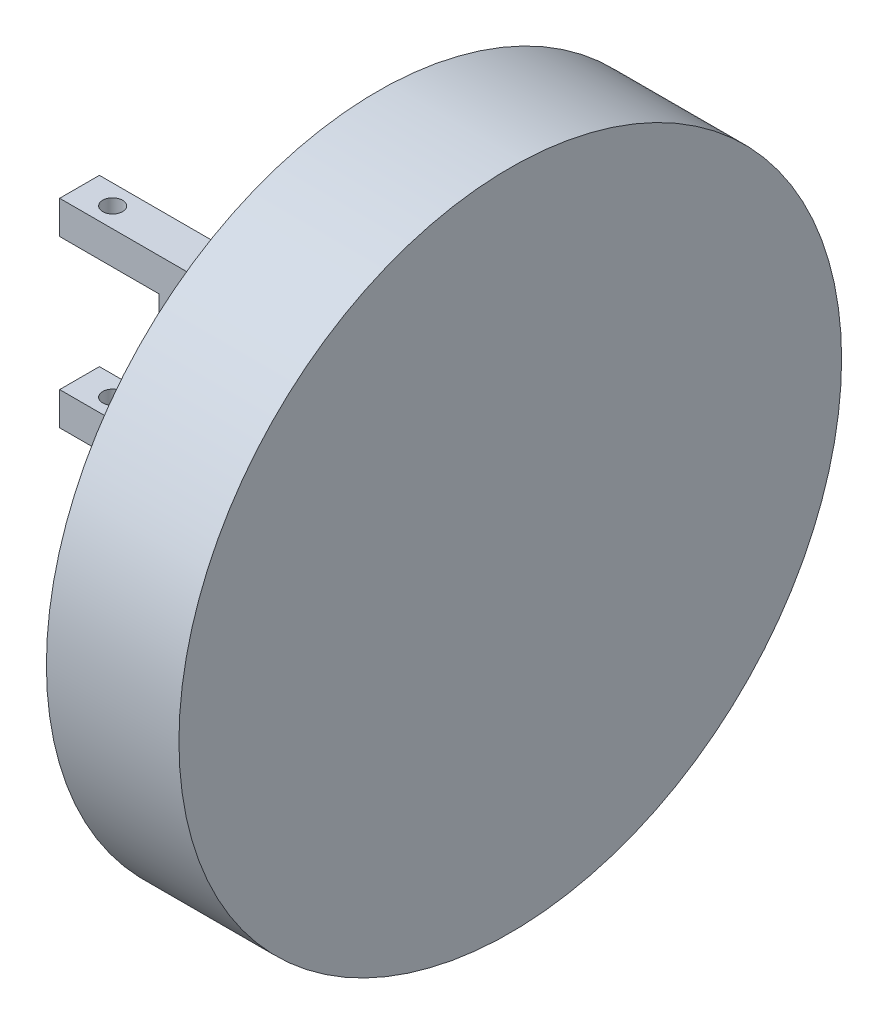
ISO-10303-21;
HEADER;
FILE_DESCRIPTION(('STEP AP214'),'2;1');
FILE_NAME('part.step','',(''),(''),'','','');
FILE_SCHEMA(('AUTOMOTIVE_DESIGN { 1 0 10303 214 1 1 1 1 }'));
ENDSEC;
DATA;
#1=APPLICATION_CONTEXT('core data for automotive mechanical design processes');
#2=APPLICATION_PROTOCOL_DEFINITION('international standard','automotive_design',2000,#1);
#3=PRODUCT_CONTEXT('',#1,'mechanical');
#4=PRODUCT('Part','Part','',(#3));
#5=PRODUCT_RELATED_PRODUCT_CATEGORY('part','',(#4));
#6=PRODUCT_DEFINITION_FORMATION('','',#4);
#7=PRODUCT_DEFINITION_CONTEXT('part definition',#1,'design');
#8=PRODUCT_DEFINITION('design','',#6,#7);
#9=PRODUCT_DEFINITION_SHAPE('','',#8);
#10=(LENGTH_UNIT() NAMED_UNIT(*) SI_UNIT(.MILLI.,.METRE.));
#11=(NAMED_UNIT(*) PLANE_ANGLE_UNIT() SI_UNIT($,.RADIAN.));
#12=(NAMED_UNIT(*) SI_UNIT($,.STERADIAN.) SOLID_ANGLE_UNIT());
#13=UNCERTAINTY_MEASURE_WITH_UNIT(LENGTH_MEASURE(1.E-05),#10,'distance_accuracy_value','');
#14=(GEOMETRIC_REPRESENTATION_CONTEXT(3) GLOBAL_UNCERTAINTY_ASSIGNED_CONTEXT((#13)) GLOBAL_UNIT_ASSIGNED_CONTEXT((#10,
#11,#12)) REPRESENTATION_CONTEXT('',''));
#15=CARTESIAN_POINT('',(0.,0.,0.));
#16=DIRECTION('',(0.,0.,1.));
#17=DIRECTION('',(1.,0.,0.));
#18=AXIS2_PLACEMENT_3D('',#15,#16,#17);
#19=CARTESIAN_POINT('',(84.9999999999999,0.,125.));
#20=DIRECTION('',(1.,0.,0.));
#21=DIRECTION('',(0.,0.,-1.));
#22=AXIS2_PLACEMENT_3D('',#19,#20,#21);
#23=CYLINDRICAL_SURFACE('',#22,1.5);
#24=CARTESIAN_POINT('',(99.9999999999999,0.,125.));
#25=DIRECTION('',(1.,0.,0.));
#26=DIRECTION('',(0.,0.,-1.));
#27=AXIS2_PLACEMENT_3D('',#24,#25,#26);
#28=CIRCLE('',#27,1.5);
#29=CARTESIAN_POINT('',(99.9999999999999,0.,123.5));
#30=VERTEX_POINT('',#29);
#31=EDGE_CURVE('E178',#30,#30,#28,.T.);
#32=ORIENTED_EDGE('',*,*,#31,.F.);
#33=EDGE_LOOP('',(#32));
#34=FACE_BOUND('',#33,.T.);
#35=CARTESIAN_POINT('',(87.4999999999999,0.,125.));
#36=DIRECTION('',(-1.,0.,0.));
#37=DIRECTION('',(0.,0.,1.));
#38=AXIS2_PLACEMENT_3D('',#35,#36,#37);
#39=CIRCLE('',#38,1.5);
#40=CARTESIAN_POINT('',(87.4999999999999,0.,123.5));
#41=VERTEX_POINT('',#40);
#42=CARTESIAN_POINT('',(87.4999999999999,0.,126.5));
#43=VERTEX_POINT('',#42);
#44=EDGE_CURVE('E52',#41,#43,#39,.F.);
#45=ORIENTED_EDGE('',*,*,#44,.T.);
#46=EDGE_CURVE('E11',#43,#41,#39,.F.);
#47=ORIENTED_EDGE('',*,*,#46,.T.);
#48=EDGE_LOOP('',(#45,#47));
#49=FACE_BOUND('',#48,.T.);
#50=ADVANCED_FACE('F43',(#34,#49),#23,.T.);
#51=CARTESIAN_POINT('',(110.,0.,125.));
#52=DIRECTION('',(-1.,0.,0.));
#53=DIRECTION('',(0.,0.,1.));
#54=AXIS2_PLACEMENT_3D('',#51,#52,#53);
#55=CYLINDRICAL_SURFACE('',#54,25.);
#56=CARTESIAN_POINT('',(110.,0.,125.));
#57=DIRECTION('',(1.,0.,0.));
#58=DIRECTION('',(0.,0.,-1.));
#59=AXIS2_PLACEMENT_3D('',#56,#57,#58);
#60=CIRCLE('',#59,25.);
#61=CARTESIAN_POINT('',(110.,0.,100.));
#62=VERTEX_POINT('',#61);
#63=EDGE_CURVE('E194',#62,#62,#60,.T.);
#64=ORIENTED_EDGE('',*,*,#63,.F.);
#65=EDGE_LOOP('',(#64));
#66=FACE_BOUND('',#65,.T.);
#67=CARTESIAN_POINT('',(99.9999999999999,0.,125.));
#68=DIRECTION('',(1.,0.,0.));
#69=DIRECTION('',(0.,0.,-1.));
#70=AXIS2_PLACEMENT_3D('',#67,#68,#69);
#71=CIRCLE('',#70,25.);
#72=CARTESIAN_POINT('',(99.9999999999999,0.,100.));
#73=VERTEX_POINT('',#72);
#74=EDGE_CURVE('E193',#73,#73,#71,.T.);
#75=ORIENTED_EDGE('',*,*,#74,.T.);
#76=EDGE_LOOP('',(#75));
#77=FACE_BOUND('',#76,.T.);
#78=ADVANCED_FACE('F45',(#66,#77),#55,.T.);
#79=CARTESIAN_POINT('',(110.,0.,0.));
#80=DIRECTION('',(1.,0.,0.));
#81=DIRECTION('',(0.,0.,-1.));
#82=AXIS2_PLACEMENT_3D('',#79,#80,#81);
#83=PLANE('',#82);
#84=ORIENTED_EDGE('',*,*,#63,.T.);
#85=EDGE_LOOP('',(#84));
#86=FACE_BOUND('',#85,.T.);
#87=ADVANCED_FACE('F206',(#86),#83,.T.);
#88=CARTESIAN_POINT('',(99.9999999999999,0.,0.));
#89=DIRECTION('',(1.,0.,0.));
#90=DIRECTION('',(0.,0.,-1.));
#91=AXIS2_PLACEMENT_3D('',#88,#89,#90);
#92=PLANE('',#91);
#93=ORIENTED_EDGE('',*,*,#31,.T.);
#94=EDGE_LOOP('',(#93));
#95=FACE_BOUND('',#94,.T.);
#96=ORIENTED_EDGE('',*,*,#74,.F.);
#97=EDGE_LOOP('',(#96));
#98=FACE_BOUND('',#97,.T.);
#99=ADVANCED_FACE('F214',(#95,#98),#92,.F.);
#100=CARTESIAN_POINT('',(87.4999999999999,0.,123.5));
#101=DIRECTION('',(-1.,0.,0.));
#102=DIRECTION('',(0.,0.,1.));
#103=AXIS2_PLACEMENT_3D('',#100,#101,#102);
#104=PLANE('',#103);
#105=ORIENTED_EDGE('',*,*,#46,.F.);
#106=DIRECTION('',(0.,-1.,0.));
#107=VECTOR('',#106,1.);
#108=CARTESIAN_POINT('',(87.4999999999999,0.,126.5));
#109=LINE('',#108,#107);
#110=CARTESIAN_POINT('',(87.4999999999999,-7.5,126.5));
#111=VERTEX_POINT('',#110);
#112=EDGE_CURVE('E114',#43,#111,#109,.T.);
#113=ORIENTED_EDGE('',*,*,#112,.T.);
#114=DIRECTION('',(0.,0.,1.));
#115=VECTOR('',#114,1.);
#116=CARTESIAN_POINT('',(87.4999999999999,-7.5,123.5));
#117=LINE('',#116,#115);
#118=CARTESIAN_POINT('',(87.4999999999999,-7.5,123.5));
#119=VERTEX_POINT('',#118);
#120=EDGE_CURVE('E117',#119,#111,#117,.T.);
#121=ORIENTED_EDGE('',*,*,#120,.F.);
#122=DIRECTION('',(0.,-1.,0.));
#123=VECTOR('',#122,1.);
#124=CARTESIAN_POINT('',(87.4999999999999,0.,123.5));
#125=LINE('',#124,#123);
#126=EDGE_CURVE('E159',#41,#119,#125,.T.);
#127=ORIENTED_EDGE('',*,*,#126,.F.);
#128=EDGE_LOOP('',(#105,#113,#121,#127));
#129=FACE_BOUND('',#128,.T.);
#130=ADVANCED_FACE('F116',(#129),#104,.F.);
#131=CARTESIAN_POINT('',(0.,0.,123.5));
#132=DIRECTION('',(0.,0.,1.));
#133=DIRECTION('',(1.,0.,0.));
#134=AXIS2_PLACEMENT_3D('',#131,#132,#133);
#135=PLANE('',#134);
#136=CARTESIAN_POINT('',(87.4999999999999,7.5,123.5));
#137=VERTEX_POINT('',#136);
#138=EDGE_CURVE('E160',#137,#41,#125,.T.);
#139=ORIENTED_EDGE('',*,*,#138,.T.);
#140=ORIENTED_EDGE('',*,*,#126,.T.);
#141=DIRECTION('',(-1.,0.,0.));
#142=VECTOR('',#141,1.);
#143=CARTESIAN_POINT('',(0.,-7.49999999999999,123.5));
#144=LINE('',#143,#142);
#145=CARTESIAN_POINT('',(77.4999999999999,-7.5,123.5));
#146=VERTEX_POINT('',#145);
#147=EDGE_CURVE('E129',#119,#146,#144,.T.);
#148=ORIENTED_EDGE('',*,*,#147,.T.);
#149=DIRECTION('',(0.,1.,0.));
#150=VECTOR('',#149,1.);
#151=CARTESIAN_POINT('',(77.4999999999999,0.,123.5));
#152=LINE('',#151,#150);
#153=CARTESIAN_POINT('',(77.4999999999999,-5.,123.5));
#154=VERTEX_POINT('',#153);
#155=EDGE_CURVE('E131',#146,#154,#152,.T.);
#156=ORIENTED_EDGE('',*,*,#155,.T.);
#157=DIRECTION('',(-1.,0.,0.));
#158=VECTOR('',#157,1.);
#159=CARTESIAN_POINT('',(0.,-5.00000000000001,123.5));
#160=LINE('',#159,#158);
#161=CARTESIAN_POINT('',(84.9999999999999,-5.,123.5));
#162=VERTEX_POINT('',#161);
#163=EDGE_CURVE('E172',#162,#154,#160,.T.);
#164=ORIENTED_EDGE('',*,*,#163,.F.);
#165=DIRECTION('',(0.,-1.,0.));
#166=VECTOR('',#165,1.);
#167=CARTESIAN_POINT('',(84.9999999999999,0.,123.5));
#168=LINE('',#167,#166);
#169=CARTESIAN_POINT('',(84.9999999999999,5.,123.5));
#170=VERTEX_POINT('',#169);
#171=EDGE_CURVE('E170',#170,#162,#168,.T.);
#172=ORIENTED_EDGE('',*,*,#171,.F.);
#173=DIRECTION('',(-1.,0.,0.));
#174=VECTOR('',#173,1.);
#175=CARTESIAN_POINT('',(0.,4.99999999999999,123.5));
#176=LINE('',#175,#174);
#177=CARTESIAN_POINT('',(77.4999999999999,5.,123.5));
#178=VERTEX_POINT('',#177);
#179=EDGE_CURVE('E168',#170,#178,#176,.T.);
#180=ORIENTED_EDGE('',*,*,#179,.T.);
#181=DIRECTION('',(0.,-1.,0.));
#182=VECTOR('',#181,1.);
#183=CARTESIAN_POINT('',(77.4999999999999,0.,123.5));
#184=LINE('',#183,#182);
#185=CARTESIAN_POINT('',(77.4999999999999,7.5,123.5));
#186=VERTEX_POINT('',#185);
#187=EDGE_CURVE('E165',#186,#178,#184,.T.);
#188=ORIENTED_EDGE('',*,*,#187,.F.);
#189=DIRECTION('',(1.,0.,0.));
#190=VECTOR('',#189,1.);
#191=CARTESIAN_POINT('',(0.,7.5,123.5));
#192=LINE('',#191,#190);
#193=EDGE_CURVE('E163',#186,#137,#192,.T.);
#194=ORIENTED_EDGE('',*,*,#193,.T.);
#195=EDGE_LOOP('',(#139,#140,#148,#156,#164,#172,#180,#188,#194));
#196=FACE_BOUND('',#195,.T.);
#197=ADVANCED_FACE('F223',(#196),#135,.F.);
#198=CARTESIAN_POINT('',(0.,0.,126.5));
#199=DIRECTION('',(0.,0.,1.));
#200=DIRECTION('',(1.,0.,0.));
#201=AXIS2_PLACEMENT_3D('',#198,#199,#200);
#202=PLANE('',#201);
#203=DIRECTION('',(0.,-1.,0.));
#204=VECTOR('',#203,1.);
#205=CARTESIAN_POINT('',(84.9999999999999,0.,126.5));
#206=LINE('',#205,#204);
#207=CARTESIAN_POINT('',(84.9999999999999,5.,126.5));
#208=VERTEX_POINT('',#207);
#209=CARTESIAN_POINT('',(84.9999999999999,-5.,126.5));
#210=VERTEX_POINT('',#209);
#211=EDGE_CURVE('E153',#208,#210,#206,.T.);
#212=ORIENTED_EDGE('',*,*,#211,.T.);
#213=DIRECTION('',(-1.,0.,0.));
#214=VECTOR('',#213,1.);
#215=CARTESIAN_POINT('',(0.,-5.00000000000001,126.5));
#216=LINE('',#215,#214);
#217=CARTESIAN_POINT('',(77.4999999999999,-5.,126.5));
#218=VERTEX_POINT('',#217);
#219=EDGE_CURVE('E155',#210,#218,#216,.T.);
#220=ORIENTED_EDGE('',*,*,#219,.T.);
#221=DIRECTION('',(0.,1.,0.));
#222=VECTOR('',#221,1.);
#223=CARTESIAN_POINT('',(77.4999999999999,0.,126.5));
#224=LINE('',#223,#222);
#225=CARTESIAN_POINT('',(77.4999999999999,-7.5,126.5));
#226=VERTEX_POINT('',#225);
#227=EDGE_CURVE('E136',#226,#218,#224,.T.);
#228=ORIENTED_EDGE('',*,*,#227,.F.);
#229=DIRECTION('',(-1.,0.,0.));
#230=VECTOR('',#229,1.);
#231=CARTESIAN_POINT('',(0.,-7.49999999999999,126.5));
#232=LINE('',#231,#230);
#233=EDGE_CURVE('E121',#111,#226,#232,.T.);
#234=ORIENTED_EDGE('',*,*,#233,.F.);
#235=ORIENTED_EDGE('',*,*,#112,.F.);
#236=CARTESIAN_POINT('',(87.4999999999999,7.5,126.5));
#237=VERTEX_POINT('',#236);
#238=EDGE_CURVE('E59',#237,#43,#109,.T.);
#239=ORIENTED_EDGE('',*,*,#238,.F.);
#240=DIRECTION('',(1.,0.,0.));
#241=VECTOR('',#240,1.);
#242=CARTESIAN_POINT('',(0.,7.5,126.5));
#243=LINE('',#242,#241);
#244=CARTESIAN_POINT('',(77.4999999999999,7.5,126.5));
#245=VERTEX_POINT('',#244);
#246=EDGE_CURVE('E144',#245,#237,#243,.T.);
#247=ORIENTED_EDGE('',*,*,#246,.F.);
#248=DIRECTION('',(0.,-1.,0.));
#249=VECTOR('',#248,1.);
#250=CARTESIAN_POINT('',(77.4999999999999,0.,126.5));
#251=LINE('',#250,#249);
#252=CARTESIAN_POINT('',(77.4999999999999,5.,126.5));
#253=VERTEX_POINT('',#252);
#254=EDGE_CURVE('E147',#245,#253,#251,.T.);
#255=ORIENTED_EDGE('',*,*,#254,.T.);
#256=DIRECTION('',(-1.,0.,0.));
#257=VECTOR('',#256,1.);
#258=CARTESIAN_POINT('',(0.,4.99999999999999,126.5));
#259=LINE('',#258,#257);
#260=EDGE_CURVE('E150',#208,#253,#259,.T.);
#261=ORIENTED_EDGE('',*,*,#260,.F.);
#262=EDGE_LOOP('',(#212,#220,#228,#234,#235,#239,#247,#255,#261));
#263=FACE_BOUND('',#262,.T.);
#264=ADVANCED_FACE('F133',(#263),#202,.T.);
#265=CARTESIAN_POINT('',(0.,-7.49999999999999,123.5));
#266=DIRECTION('',(0.,1.,0.));
#267=DIRECTION('',(-1.,0.,0.));
#268=AXIS2_PLACEMENT_3D('',#265,#266,#267);
#269=PLANE('',#268);
#270=CARTESIAN_POINT('',(79.9999999999999,-7.5,125.));
#271=DIRECTION('',(0.,1.,0.));
#272=DIRECTION('',(-1.,0.,0.));
#273=AXIS2_PLACEMENT_3D('',#270,#271,#272);
#274=CIRCLE('',#273,0.749999999999999);
#275=CARTESIAN_POINT('',(79.2499999999999,-7.5,125.));
#276=VERTEX_POINT('',#275);
#277=EDGE_CURVE('E137',#276,#276,#274,.T.);
#278=ORIENTED_EDGE('',*,*,#277,.T.);
#279=EDGE_LOOP('',(#278));
#280=FACE_BOUND('',#279,.T.);
#281=ORIENTED_EDGE('',*,*,#120,.T.);
#282=ORIENTED_EDGE('',*,*,#233,.T.);
#283=DIRECTION('',(0.,0.,1.));
#284=VECTOR('',#283,1.);
#285=CARTESIAN_POINT('',(77.4999999999999,-7.5,123.5));
#286=LINE('',#285,#284);
#287=EDGE_CURVE('E176',#146,#226,#286,.T.);
#288=ORIENTED_EDGE('',*,*,#287,.F.);
#289=ORIENTED_EDGE('',*,*,#147,.F.);
#290=EDGE_LOOP('',(#281,#282,#288,#289));
#291=FACE_BOUND('',#290,.T.);
#292=ADVANCED_FACE('F125',(#280,#291),#269,.F.);
#293=CARTESIAN_POINT('',(77.4999999999999,0.,123.5));
#294=DIRECTION('',(1.,0.,0.));
#295=DIRECTION('',(0.,0.,-1.));
#296=AXIS2_PLACEMENT_3D('',#293,#294,#295);
#297=PLANE('',#296);
#298=ORIENTED_EDGE('',*,*,#287,.T.);
#299=ORIENTED_EDGE('',*,*,#227,.T.);
#300=DIRECTION('',(0.,0.,1.));
#301=VECTOR('',#300,1.);
#302=CARTESIAN_POINT('',(77.4999999999999,-5.,123.5));
#303=LINE('',#302,#301);
#304=EDGE_CURVE('E179',#154,#218,#303,.T.);
#305=ORIENTED_EDGE('',*,*,#304,.F.);
#306=ORIENTED_EDGE('',*,*,#155,.F.);
#307=EDGE_LOOP('',(#298,#299,#305,#306));
#308=FACE_BOUND('',#307,.T.);
#309=ADVANCED_FACE('F263',(#308),#297,.F.);
#310=CARTESIAN_POINT('',(0.,-5.00000000000001,123.5));
#311=DIRECTION('',(0.,1.,0.));
#312=DIRECTION('',(-1.,0.,0.));
#313=AXIS2_PLACEMENT_3D('',#310,#311,#312);
#314=PLANE('',#313);
#315=CARTESIAN_POINT('',(79.9999999999999,-5.,125.));
#316=DIRECTION('',(0.,1.,0.));
#317=DIRECTION('',(-1.,0.,0.));
#318=AXIS2_PLACEMENT_3D('',#315,#316,#317);
#319=CIRCLE('',#318,0.749999999999999);
#320=CARTESIAN_POINT('',(79.2499999999999,-5.,125.));
#321=VERTEX_POINT('',#320);
#322=EDGE_CURVE('E140',#321,#321,#319,.T.);
#323=ORIENTED_EDGE('',*,*,#322,.F.);
#324=EDGE_LOOP('',(#323));
#325=FACE_BOUND('',#324,.T.);
#326=ORIENTED_EDGE('',*,*,#304,.T.);
#327=ORIENTED_EDGE('',*,*,#219,.F.);
#328=DIRECTION('',(0.,0.,1.));
#329=VECTOR('',#328,1.);
#330=CARTESIAN_POINT('',(84.9999999999999,-5.,123.5));
#331=LINE('',#330,#329);
#332=EDGE_CURVE('E181',#162,#210,#331,.T.);
#333=ORIENTED_EDGE('',*,*,#332,.F.);
#334=ORIENTED_EDGE('',*,*,#163,.T.);
#335=EDGE_LOOP('',(#326,#327,#333,#334));
#336=FACE_BOUND('',#335,.T.);
#337=ADVANCED_FACE('F259',(#325,#336),#314,.T.);
#338=CARTESIAN_POINT('',(0.,4.99999999999999,123.5));
#339=DIRECTION('',(0.,1.,0.));
#340=DIRECTION('',(-1.,0.,0.));
#341=AXIS2_PLACEMENT_3D('',#338,#339,#340);
#342=PLANE('',#341);
#343=CARTESIAN_POINT('',(79.9999999999999,5.,125.));
#344=DIRECTION('',(0.,1.,0.));
#345=DIRECTION('',(-1.,0.,0.));
#346=AXIS2_PLACEMENT_3D('',#343,#344,#345);
#347=CIRCLE('',#346,0.749999999999999);
#348=CARTESIAN_POINT('',(79.2499999999999,5.,125.));
#349=VERTEX_POINT('',#348);
#350=EDGE_CURVE('E385',#349,#349,#347,.T.);
#351=ORIENTED_EDGE('',*,*,#350,.T.);
#352=EDGE_LOOP('',(#351));
#353=FACE_BOUND('',#352,.T.);
#354=DIRECTION('',(0.,0.,1.));
#355=VECTOR('',#354,1.);
#356=CARTESIAN_POINT('',(84.9999999999999,5.,123.5));
#357=LINE('',#356,#355);
#358=EDGE_CURVE('E184',#170,#208,#357,.T.);
#359=ORIENTED_EDGE('',*,*,#358,.T.);
#360=ORIENTED_EDGE('',*,*,#260,.T.);
#361=DIRECTION('',(0.,0.,1.));
#362=VECTOR('',#361,1.);
#363=CARTESIAN_POINT('',(77.4999999999999,5.,123.5));
#364=LINE('',#363,#362);
#365=EDGE_CURVE('E186',#178,#253,#364,.T.);
#366=ORIENTED_EDGE('',*,*,#365,.F.);
#367=ORIENTED_EDGE('',*,*,#179,.F.);
#368=EDGE_LOOP('',(#359,#360,#366,#367));
#369=FACE_BOUND('',#368,.T.);
#370=ADVANCED_FACE('F251',(#353,#369),#342,.F.);
#371=CARTESIAN_POINT('',(77.4999999999999,0.,123.5));
#372=DIRECTION('',(-1.,0.,0.));
#373=DIRECTION('',(0.,0.,1.));
#374=AXIS2_PLACEMENT_3D('',#371,#372,#373);
#375=PLANE('',#374);
#376=ORIENTED_EDGE('',*,*,#365,.T.);
#377=ORIENTED_EDGE('',*,*,#254,.F.);
#378=DIRECTION('',(0.,0.,1.));
#379=VECTOR('',#378,1.);
#380=CARTESIAN_POINT('',(77.4999999999999,7.5,123.5));
#381=LINE('',#380,#379);
#382=EDGE_CURVE('E188',#186,#245,#381,.T.);
#383=ORIENTED_EDGE('',*,*,#382,.F.);
#384=ORIENTED_EDGE('',*,*,#187,.T.);
#385=EDGE_LOOP('',(#376,#377,#383,#384));
#386=FACE_BOUND('',#385,.T.);
#387=ADVANCED_FACE('F245',(#386),#375,.T.);
#388=CARTESIAN_POINT('',(0.,7.5,123.5));
#389=DIRECTION('',(0.,-1.,0.));
#390=DIRECTION('',(0.,0.,-1.));
#391=AXIS2_PLACEMENT_3D('',#388,#389,#390);
#392=PLANE('',#391);
#393=CARTESIAN_POINT('',(79.9999999999999,7.5,125.));
#394=DIRECTION('',(0.,-1.,0.));
#395=DIRECTION('',(0.,0.,-1.));
#396=AXIS2_PLACEMENT_3D('',#393,#394,#395);
#397=CIRCLE('',#396,0.749999999999999);
#398=CARTESIAN_POINT('',(79.9999999999999,7.5,124.25));
#399=VERTEX_POINT('',#398);
#400=EDGE_CURVE('E47',#399,#399,#397,.T.);
#401=ORIENTED_EDGE('',*,*,#400,.T.);
#402=EDGE_LOOP('',(#401));
#403=FACE_BOUND('',#402,.T.);
#404=ORIENTED_EDGE('',*,*,#382,.T.);
#405=ORIENTED_EDGE('',*,*,#246,.T.);
#406=DIRECTION('',(0.,0.,1.));
#407=VECTOR('',#406,1.);
#408=CARTESIAN_POINT('',(87.4999999999999,7.5,123.5));
#409=LINE('',#408,#407);
#410=EDGE_CURVE('E130',#137,#237,#409,.T.);
#411=ORIENTED_EDGE('',*,*,#410,.F.);
#412=ORIENTED_EDGE('',*,*,#193,.F.);
#413=EDGE_LOOP('',(#404,#405,#411,#412));
#414=FACE_BOUND('',#413,.T.);
#415=ADVANCED_FACE('F236',(#403,#414),#392,.F.);
#416=ORIENTED_EDGE('',*,*,#44,.F.);
#417=ORIENTED_EDGE('',*,*,#138,.F.);
#418=ORIENTED_EDGE('',*,*,#410,.T.);
#419=ORIENTED_EDGE('',*,*,#238,.T.);
#420=EDGE_LOOP('',(#416,#417,#418,#419));
#421=FACE_BOUND('',#420,.T.);
#422=ADVANCED_FACE('F225',(#421),#104,.F.);
#423=CARTESIAN_POINT('',(84.9999999999999,0.,125.));
#424=DIRECTION('',(1.,0.,0.));
#425=DIRECTION('',(0.,0.,-1.));
#426=AXIS2_PLACEMENT_3D('',#423,#424,#425);
#427=PLANE('',#426);
#428=ORIENTED_EDGE('',*,*,#358,.F.);
#429=ORIENTED_EDGE('',*,*,#171,.T.);
#430=ORIENTED_EDGE('',*,*,#332,.T.);
#431=ORIENTED_EDGE('',*,*,#211,.F.);
#432=EDGE_LOOP('',(#428,#429,#430,#431));
#433=FACE_BOUND('',#432,.T.);
#434=ADVANCED_FACE('F211',(#433),#427,.F.);
#435=CARTESIAN_POINT('',(79.9999999999999,-25.,125.));
#436=DIRECTION('',(0.,1.,0.));
#437=DIRECTION('',(0.,0.,1.));
#438=AXIS2_PLACEMENT_3D('',#435,#436,#437);
#439=CYLINDRICAL_SURFACE('',#438,0.749999999999999);
#440=ORIENTED_EDGE('',*,*,#400,.F.);
#441=EDGE_LOOP('',(#440));
#442=FACE_BOUND('',#441,.T.);
#443=ORIENTED_EDGE('',*,*,#350,.F.);
#444=EDGE_LOOP('',(#443));
#445=FACE_BOUND('',#444,.T.);
#446=ADVANCED_FACE('F242',(#442,#445),#439,.F.);
#447=ORIENTED_EDGE('',*,*,#322,.T.);
#448=EDGE_LOOP('',(#447));
#449=FACE_BOUND('',#448,.T.);
#450=ORIENTED_EDGE('',*,*,#277,.F.);
#451=EDGE_LOOP('',(#450));
#452=FACE_BOUND('',#451,.T.);
#453=ADVANCED_FACE('F270',(#449,#452),#439,.F.);
#454=CLOSED_SHELL('',(#50,#78,#87,#99,#130,#197,#264,#292,#309,#337,#370,#387,#415,#422,#434,
#446,#453));
#455=MANIFOLD_SOLID_BREP('B2',#454);
#456=ADVANCED_BREP_SHAPE_REPRESENTATION('',(#18,#455),#14);
#457=SHAPE_DEFINITION_REPRESENTATION(#9,#456);
ENDSEC;
END-ISO-10303-21;
